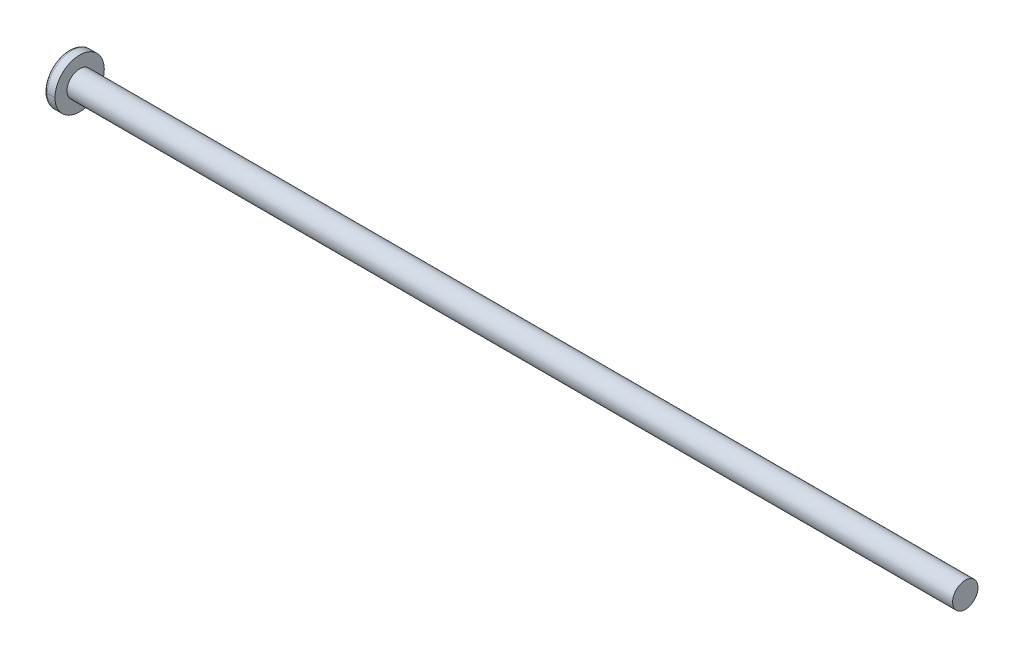
ISO-10303-21;
HEADER;
FILE_DESCRIPTION(('STEP AP214'),'2;1');
FILE_NAME('part.step','',(''),(''),'','','');
FILE_SCHEMA(('AUTOMOTIVE_DESIGN { 1 0 10303 214 1 1 1 1 }'));
ENDSEC;
DATA;
#1=APPLICATION_CONTEXT('core data for automotive mechanical design processes');
#2=APPLICATION_PROTOCOL_DEFINITION('international standard','automotive_design',2000,#1);
#3=PRODUCT_CONTEXT('',#1,'mechanical');
#4=PRODUCT('Part','Part','',(#3));
#5=PRODUCT_RELATED_PRODUCT_CATEGORY('part','',(#4));
#6=PRODUCT_DEFINITION_FORMATION('','',#4);
#7=PRODUCT_DEFINITION_CONTEXT('part definition',#1,'design');
#8=PRODUCT_DEFINITION('design','',#6,#7);
#9=PRODUCT_DEFINITION_SHAPE('','',#8);
#10=(LENGTH_UNIT() NAMED_UNIT(*) SI_UNIT(.MILLI.,.METRE.));
#11=(NAMED_UNIT(*) PLANE_ANGLE_UNIT() SI_UNIT($,.RADIAN.));
#12=(NAMED_UNIT(*) SI_UNIT($,.STERADIAN.) SOLID_ANGLE_UNIT());
#13=UNCERTAINTY_MEASURE_WITH_UNIT(LENGTH_MEASURE(1.E-05),#10,'distance_accuracy_value','');
#14=(GEOMETRIC_REPRESENTATION_CONTEXT(3) GLOBAL_UNCERTAINTY_ASSIGNED_CONTEXT((#13)) GLOBAL_UNIT_ASSIGNED_CONTEXT((#10,
#11,#12)) REPRESENTATION_CONTEXT('',''));
#15=CARTESIAN_POINT('',(0.,0.,0.));
#16=DIRECTION('',(0.,0.,1.));
#17=DIRECTION('',(1.,0.,0.));
#18=AXIS2_PLACEMENT_3D('',#15,#16,#17);
#19=CARTESIAN_POINT('',(-0.334022400521806,2.22044604925031E-13,0.));
#20=DIRECTION('',(1.,0.,0.));
#21=DIRECTION('',(0.,0.,1.));
#22=AXIS2_PLACEMENT_3D('',#19,#20,#21);
#23=CYLINDRICAL_SURFACE('',#22,2.1209);
#24=DIRECTION('',(1.,0.,0.));
#25=VECTOR('',#24,1.);
#26=CARTESIAN_POINT('',(-0.334022400521806,3.88578058618805E-13,2.12090000000008));
#27=LINE('',#26,#25);
#28=CARTESIAN_POINT('',(-0.668044801043613,3.88578058618805E-13,2.12090000000008));
#29=VERTEX_POINT('',#28);
#30=CARTESIAN_POINT('',(0.,-1.11022302462516E-13,2.12090000000002));
#31=VERTEX_POINT('',#30);
#32=EDGE_CURVE('E51',#29,#31,#27,.T.);
#33=ORIENTED_EDGE('',*,*,#32,.F.);
#34=CARTESIAN_POINT('',(-0.668044801043613,2.22044604925031E-13,0.));
#35=DIRECTION('',(1.,0.,0.));
#36=DIRECTION('',(0.,0.,1.));
#37=AXIS2_PLACEMENT_3D('',#34,#35,#36);
#38=CIRCLE('',#37,2.1209);
#39=CARTESIAN_POINT('',(-0.668044801043613,1.11022302462516E-13,-2.12089999999995));
#40=VERTEX_POINT('',#39);
#41=EDGE_CURVE('E167',#29,#40,#38,.T.);
#42=ORIENTED_EDGE('',*,*,#41,.T.);
#43=DIRECTION('',(-1.,0.,0.));
#44=VECTOR('',#43,1.);
#45=CARTESIAN_POINT('',(-0.334022400521806,1.11022302462516E-13,-2.12089999999995));
#46=LINE('',#45,#44);
#47=CARTESIAN_POINT('',(0.,0.,-2.12089999999994));
#48=VERTEX_POINT('',#47);
#49=EDGE_CURVE('E11',#48,#40,#46,.T.);
#50=ORIENTED_EDGE('',*,*,#49,.F.);
#51=CARTESIAN_POINT('',(0.,0.,0.));
#52=DIRECTION('',(1.,0.,0.));
#53=DIRECTION('',(0.,0.,1.));
#54=AXIS2_PLACEMENT_3D('',#51,#52,#53);
#55=CIRCLE('',#54,2.1209);
#56=EDGE_CURVE('E277',#31,#48,#55,.T.);
#57=ORIENTED_EDGE('',*,*,#56,.F.);
#58=EDGE_LOOP('',(#33,#42,#50,#57));
#59=FACE_BOUND('',#58,.T.);
#60=ADVANCED_FACE('F40',(#59),#23,.T.);
#61=CARTESIAN_POINT('',(-0.334022400521806,2.22044604925031E-13,0.));
#62=DIRECTION('',(1.,0.,0.));
#63=DIRECTION('',(0.,0.,1.));
#64=AXIS2_PLACEMENT_3D('',#61,#62,#63);
#65=CYLINDRICAL_SURFACE('',#64,2.1209);
#66=ORIENTED_EDGE('',*,*,#32,.T.);
#67=CARTESIAN_POINT('',(0.,0.,0.));
#68=DIRECTION('',(1.,0.,0.));
#69=DIRECTION('',(0.,0.,1.));
#70=AXIS2_PLACEMENT_3D('',#67,#68,#69);
#71=CIRCLE('',#70,2.1209);
#72=EDGE_CURVE('E250',#48,#31,#71,.T.);
#73=ORIENTED_EDGE('',*,*,#72,.F.);
#74=ORIENTED_EDGE('',*,*,#49,.T.);
#75=CARTESIAN_POINT('',(-0.668044801043613,2.22044604925031E-13,0.));
#76=DIRECTION('',(1.,0.,0.));
#77=DIRECTION('',(0.,0.,1.));
#78=AXIS2_PLACEMENT_3D('',#75,#76,#77);
#79=CIRCLE('',#78,2.1209);
#80=EDGE_CURVE('E173',#40,#29,#79,.T.);
#81=ORIENTED_EDGE('',*,*,#80,.T.);
#82=EDGE_LOOP('',(#66,#73,#74,#81));
#83=FACE_BOUND('',#82,.T.);
#84=ADVANCED_FACE('F409',(#83),#65,.T.);
#85=CARTESIAN_POINT('',(-0.668044801043613,2.22044604925031E-13,0.));
#86=DIRECTION('',(1.,0.,0.));
#87=DIRECTION('',(0.,0.,-1.));
#88=AXIS2_PLACEMENT_3D('',#85,#86,#87);
#89=TOROIDAL_SURFACE('',#88,1.8669,0.254);
#90=CARTESIAN_POINT('',(-0.668044801043613,0.,-1.8669));
#91=DIRECTION('',(0.,-1.,0.));
#92=DIRECTION('',(0.,0.,-1.));
#93=AXIS2_PLACEMENT_3D('',#90,#91,#92);
#94=CIRCLE('',#93,0.254);
#95=CARTESIAN_POINT('',(-0.866705762537757,0.,-2.02517135678376));
#96=VERTEX_POINT('',#95);
#97=EDGE_CURVE('E174',#96,#40,#94,.T.);
#98=ORIENTED_EDGE('',*,*,#97,.T.);
#99=ORIENTED_EDGE('',*,*,#41,.F.);
#100=CARTESIAN_POINT('',(-0.668044801043606,2.22044604925031E-13,1.86690000000018));
#101=DIRECTION('',(0.,-1.,0.));
#102=DIRECTION('',(0.,0.,1.));
#103=AXIS2_PLACEMENT_3D('',#100,#101,#102);
#104=CIRCLE('',#103,0.254);
#105=CARTESIAN_POINT('',(-0.866705762537751,0.,2.02517135678391));
#106=VERTEX_POINT('',#105);
#107=EDGE_CURVE('E161',#29,#106,#104,.T.);
#108=ORIENTED_EDGE('',*,*,#107,.T.);
#109=CARTESIAN_POINT('',(-0.866705762537757,2.22044604925031E-13,0.));
#110=DIRECTION('',(1.,0.,0.));
#111=DIRECTION('',(0.,0.,1.));
#112=AXIS2_PLACEMENT_3D('',#109,#110,#111);
#113=CIRCLE('',#112,2.02517135678392);
#114=EDGE_CURVE('E165',#106,#96,#113,.T.);
#115=ORIENTED_EDGE('',*,*,#114,.T.);
#116=EDGE_LOOP('',(#98,#99,#108,#115));
#117=FACE_BOUND('',#116,.T.);
#118=ADVANCED_FACE('F164',(#117),#89,.T.);
#119=CARTESIAN_POINT('',(0.,0.,1.06045000000005));
#120=DIRECTION('',(1.,0.,0.));
#121=DIRECTION('',(0.,0.,1.));
#122=AXIS2_PLACEMENT_3D('',#119,#120,#121);
#123=PLANE('',#122);
#124=ORIENTED_EDGE('',*,*,#56,.T.);
#125=ORIENTED_EDGE('',*,*,#72,.T.);
#126=EDGE_LOOP('',(#124,#125));
#127=FACE_BOUND('',#126,.T.);
#128=CARTESIAN_POINT('',(0.,0.,0.));
#129=DIRECTION('',(-1.,0.,0.));
#130=DIRECTION('',(0.,0.,-1.));
#131=AXIS2_PLACEMENT_3D('',#128,#129,#130);
#132=CIRCLE('',#131,1.0922);
#133=CARTESIAN_POINT('',(0.,0.,-1.0922));
#134=VERTEX_POINT('',#133);
#135=EDGE_CURVE('E44',#134,#134,#132,.T.);
#136=ORIENTED_EDGE('',*,*,#135,.T.);
#137=EDGE_LOOP('',(#136));
#138=FACE_BOUND('',#137,.T.);
#139=ADVANCED_FACE('F486',(#127,#138),#123,.T.);
#140=CARTESIAN_POINT('',(-0.668044801043613,2.22044604925031E-13,0.));
#141=DIRECTION('',(1.,0.,0.));
#142=DIRECTION('',(0.,0.,-1.));
#143=AXIS2_PLACEMENT_3D('',#140,#141,#142);
#144=TOROIDAL_SURFACE('',#143,1.8669,0.254);
#145=ORIENTED_EDGE('',*,*,#97,.F.);
#146=CARTESIAN_POINT('',(-0.866705762537757,2.22044604925031E-13,0.));
#147=DIRECTION('',(1.,0.,0.));
#148=DIRECTION('',(0.,0.,1.));
#149=AXIS2_PLACEMENT_3D('',#146,#147,#148);
#150=CIRCLE('',#149,2.02517135678392);
#151=EDGE_CURVE('E187',#96,#106,#150,.T.);
#152=ORIENTED_EDGE('',*,*,#151,.T.);
#153=ORIENTED_EDGE('',*,*,#107,.F.);
#154=ORIENTED_EDGE('',*,*,#80,.F.);
#155=EDGE_LOOP('',(#145,#152,#153,#154));
#156=FACE_BOUND('',#155,.T.);
#157=ADVANCED_FACE('F188',(#156),#144,.T.);
#158=CARTESIAN_POINT('',(1.67527338709678,0.,0.));
#159=DIRECTION('',(0.,0.,1.));
#160=DIRECTION('',(1.,0.,0.));
#161=AXIS2_PLACEMENT_3D('',#158,#159,#160);
#162=SPHERICAL_SURFACE('',#161,3.25007338709678);
#163=CARTESIAN_POINT('',(1.67527338709678,0.,0.));
#164=DIRECTION('',(0.,-1.,0.));
#165=DIRECTION('',(0.,0.,1.));
#166=AXIS2_PLACEMENT_3D('',#163,#164,#165);
#167=CIRCLE('',#166,3.25007338709678);
#168=CARTESIAN_POINT('',(-1.33228366332031,-1.11022302462516E-13,1.23189999999998));
#169=VERTEX_POINT('',#168);
#170=EDGE_CURVE('E180',#106,#169,#167,.T.);
#171=ORIENTED_EDGE('',*,*,#170,.T.);
#172=CARTESIAN_POINT('',(1.67527338709678,0.,1.23190000000004));
#173=DIRECTION('',(0.,0.,1.));
#174=DIRECTION('',(0.,1.,0.));
#175=AXIS2_PLACEMENT_3D('',#172,#173,#174);
#176=CIRCLE('',#175,3.00755705041729);
#177=CARTESIAN_POINT('',(-1.32452437300552,-0.215900000000047,1.23190000000013));
#178=VERTEX_POINT('',#177);
#179=EDGE_CURVE('E198',#169,#178,#176,.T.);
#180=ORIENTED_EDGE('',*,*,#179,.T.);
#181=CARTESIAN_POINT('',(1.67527338709678,-0.215899999999436,3.60822483003176E-13));
#182=DIRECTION('',(0.,-1.,0.));
#183=DIRECTION('',(0.,0.,1.));
#184=AXIS2_PLACEMENT_3D('',#181,#182,#183);
#185=CIRCLE('',#184,3.24289441880471);
#186=CARTESIAN_POINT('',(-1.5604261356517,-0.215899999999991,0.215900000000033));
#187=VERTEX_POINT('',#186);
#188=EDGE_CURVE('E266',#178,#187,#185,.T.);
#189=ORIENTED_EDGE('',*,*,#188,.T.);
#190=CARTESIAN_POINT('',(1.67527338709678,0.,0.215900000000005));
#191=DIRECTION('',(0.,0.,1.));
#192=DIRECTION('',(0.,1.,0.));
#193=AXIS2_PLACEMENT_3D('',#190,#191,#192);
#194=CIRCLE('',#193,3.24289441880471);
#195=CARTESIAN_POINT('',(-1.32452437300552,-1.23189999999979,0.215900000000047));
#196=VERTEX_POINT('',#195);
#197=EDGE_CURVE('E241',#187,#196,#194,.T.);
#198=ORIENTED_EDGE('',*,*,#197,.T.);
#199=CARTESIAN_POINT('',(1.67527338709678,-1.2318999999999,0.));
#200=DIRECTION('',(0.,-1.,0.));
#201=DIRECTION('',(0.,0.,1.));
#202=AXIS2_PLACEMENT_3D('',#199,#200,#201);
#203=CIRCLE('',#202,3.00755705041729);
#204=CARTESIAN_POINT('',(-1.32452437300552,-1.23189999999979,-0.215899999999922));
#205=VERTEX_POINT('',#204);
#206=EDGE_CURVE('E242',#196,#205,#203,.T.);
#207=ORIENTED_EDGE('',*,*,#206,.T.);
#208=CARTESIAN_POINT('',(1.67527338709678,1.11022302462516E-13,-0.215899999999852));
#209=DIRECTION('',(0.,0.,-1.));
#210=DIRECTION('',(0.,-1.,0.));
#211=AXIS2_PLACEMENT_3D('',#208,#209,#210);
#212=CIRCLE('',#211,3.24289441880471);
#213=CARTESIAN_POINT('',(-1.56042613565169,-0.21589999999988,-0.215899999999991));
#214=VERTEX_POINT('',#213);
#215=EDGE_CURVE('E301',#205,#214,#212,.T.);
#216=ORIENTED_EDGE('',*,*,#215,.T.);
#217=CARTESIAN_POINT('',(1.67527338709678,-0.215899999999436,3.60822483003176E-13));
#218=DIRECTION('',(0.,-1.,0.));
#219=DIRECTION('',(0.,0.,1.));
#220=AXIS2_PLACEMENT_3D('',#217,#218,#219);
#221=CIRCLE('',#220,3.24289441880471);
#222=CARTESIAN_POINT('',(-1.32452437300552,-0.215899999999936,-1.23189999999994));
#223=VERTEX_POINT('',#222);
#224=EDGE_CURVE('E211',#214,#223,#221,.T.);
#225=ORIENTED_EDGE('',*,*,#224,.T.);
#226=CARTESIAN_POINT('',(1.67527338709678,0.,-1.23189999999997));
#227=DIRECTION('',(0.,0.,-1.));
#228=DIRECTION('',(0.,-1.,0.));
#229=AXIS2_PLACEMENT_3D('',#226,#227,#228);
#230=CIRCLE('',#229,3.00755705041729);
#231=CARTESIAN_POINT('',(-1.33228366332051,0.,-1.23190000000005));
#232=VERTEX_POINT('',#231);
#233=EDGE_CURVE('E333',#223,#232,#230,.T.);
#234=ORIENTED_EDGE('',*,*,#233,.T.);
#235=CARTESIAN_POINT('',(1.67527338709678,0.,0.));
#236=DIRECTION('',(0.,-1.,0.));
#237=DIRECTION('',(0.,0.,1.));
#238=AXIS2_PLACEMENT_3D('',#235,#236,#237);
#239=CIRCLE('',#238,3.25007338709678);
#240=EDGE_CURVE('E183',#232,#96,#239,.T.);
#241=ORIENTED_EDGE('',*,*,#240,.T.);
#242=ORIENTED_EDGE('',*,*,#114,.F.);
#243=EDGE_LOOP('',(#171,#180,#189,#198,#207,#216,#225,#234,#241,#242));
#244=FACE_BOUND('',#243,.T.);
#245=ADVANCED_FACE('F177',(#244),#162,.T.);
#246=CARTESIAN_POINT('',(4.7625,0.,0.));
#247=DIRECTION('',(-1.,0.,0.));
#248=DIRECTION('',(0.,0.,-1.));
#249=AXIS2_PLACEMENT_3D('',#246,#247,#248);
#250=CYLINDRICAL_SURFACE('',#249,1.0922);
#251=ORIENTED_EDGE('',*,*,#135,.F.);
#252=EDGE_LOOP('',(#251));
#253=FACE_BOUND('',#252,.T.);
#254=CARTESIAN_POINT('',(76.2,0.,1.11022302462516E-13));
#255=DIRECTION('',(1.,0.,0.));
#256=DIRECTION('',(0.,0.,-1.));
#257=AXIS2_PLACEMENT_3D('',#254,#255,#256);
#258=CIRCLE('',#257,1.0922);
#259=CARTESIAN_POINT('',(76.2,0.,-1.09219999999989));
#260=VERTEX_POINT('',#259);
#261=EDGE_CURVE('E343',#260,#260,#258,.T.);
#262=ORIENTED_EDGE('',*,*,#261,.F.);
#263=EDGE_LOOP('',(#262));
#264=FACE_BOUND('',#263,.T.);
#265=ADVANCED_FACE('F473',(#253,#264),#250,.T.);
#266=CARTESIAN_POINT('',(1.67527338709678,0.,0.));
#267=DIRECTION('',(0.,0.,1.));
#268=DIRECTION('',(1.,0.,0.));
#269=AXIS2_PLACEMENT_3D('',#266,#267,#268);
#270=SPHERICAL_SURFACE('',#269,3.25007338709678);
#271=ORIENTED_EDGE('',*,*,#170,.F.);
#272=ORIENTED_EDGE('',*,*,#151,.F.);
#273=ORIENTED_EDGE('',*,*,#240,.F.);
#274=CARTESIAN_POINT('',(1.67527338709678,0.,-1.23189999999997));
#275=DIRECTION('',(0.,0.,-1.));
#276=DIRECTION('',(0.,-1.,0.));
#277=AXIS2_PLACEMENT_3D('',#274,#275,#276);
#278=CIRCLE('',#277,3.00755705041729);
#279=CARTESIAN_POINT('',(-1.32452437300552,0.215900000000102,-1.23190000000001));
#280=VERTEX_POINT('',#279);
#281=EDGE_CURVE('E212',#232,#280,#278,.T.);
#282=ORIENTED_EDGE('',*,*,#281,.T.);
#283=CARTESIAN_POINT('',(1.67527338709678,0.215899999999991,0.));
#284=DIRECTION('',(0.,1.,0.));
#285=DIRECTION('',(0.,0.,-1.));
#286=AXIS2_PLACEMENT_3D('',#283,#284,#285);
#287=CIRCLE('',#286,3.24289441880471);
#288=CARTESIAN_POINT('',(-1.5604261356517,0.215900000000213,-0.215899999999936));
#289=VERTEX_POINT('',#288);
#290=EDGE_CURVE('E218',#280,#289,#287,.T.);
#291=ORIENTED_EDGE('',*,*,#290,.T.);
#292=CARTESIAN_POINT('',(1.67527338709678,1.11022302462516E-13,-0.215899999999852));
#293=DIRECTION('',(0.,0.,-1.));
#294=DIRECTION('',(0.,-1.,0.));
#295=AXIS2_PLACEMENT_3D('',#292,#293,#294);
#296=CIRCLE('',#295,3.24289441880471);
#297=CARTESIAN_POINT('',(-1.32452437300552,1.23190000000001,-0.215899999999949));
#298=VERTEX_POINT('',#297);
#299=EDGE_CURVE('E271',#289,#298,#296,.T.);
#300=ORIENTED_EDGE('',*,*,#299,.T.);
#301=CARTESIAN_POINT('',(1.67527338709679,1.23190000000029,1.66533453693773E-13));
#302=DIRECTION('',(0.,1.,0.));
#303=DIRECTION('',(0.,0.,-1.));
#304=AXIS2_PLACEMENT_3D('',#301,#302,#303);
#305=CIRCLE('',#304,3.00755705041729);
#306=CARTESIAN_POINT('',(-1.32452437300552,1.23190000000001,0.215899999999991));
#307=VERTEX_POINT('',#306);
#308=EDGE_CURVE('E270',#298,#307,#305,.T.);
#309=ORIENTED_EDGE('',*,*,#308,.T.);
#310=CARTESIAN_POINT('',(1.67527338709678,0.,0.215900000000005));
#311=DIRECTION('',(0.,0.,1.));
#312=DIRECTION('',(0.,1.,0.));
#313=AXIS2_PLACEMENT_3D('',#310,#311,#312);
#314=CIRCLE('',#313,3.24289441880471);
#315=CARTESIAN_POINT('',(-1.5604261356517,0.215900000000047,0.215899999999963));
#316=VERTEX_POINT('',#315);
#317=EDGE_CURVE('E206',#307,#316,#314,.T.);
#318=ORIENTED_EDGE('',*,*,#317,.T.);
#319=CARTESIAN_POINT('',(1.67527338709678,0.215899999999991,0.));
#320=DIRECTION('',(0.,1.,0.));
#321=DIRECTION('',(0.,0.,-1.));
#322=AXIS2_PLACEMENT_3D('',#319,#320,#321);
#323=CIRCLE('',#322,3.24289441880471);
#324=CARTESIAN_POINT('',(-1.32452437300552,0.215900000000102,1.23190000000008));
#325=VERTEX_POINT('',#324);
#326=EDGE_CURVE('E223',#316,#325,#323,.T.);
#327=ORIENTED_EDGE('',*,*,#326,.T.);
#328=CARTESIAN_POINT('',(1.67527338709678,0.,1.23190000000004));
#329=DIRECTION('',(0.,0.,1.));
#330=DIRECTION('',(0.,1.,0.));
#331=AXIS2_PLACEMENT_3D('',#328,#329,#330);
#332=CIRCLE('',#331,3.00755705041729);
#333=EDGE_CURVE('E196',#325,#169,#332,.T.);
#334=ORIENTED_EDGE('',*,*,#333,.T.);
#335=EDGE_LOOP('',(#271,#272,#273,#282,#291,#300,#309,#318,#327,#334));
#336=FACE_BOUND('',#335,.T.);
#337=ADVANCED_FACE('F193',(#336),#270,.T.);
#338=CARTESIAN_POINT('',(-0.914399999999801,-1.11022302462516E-13,1.23189999999998));
#339=DIRECTION('',(0.,0.,1.));
#340=DIRECTION('',(1.,0.,0.));
#341=AXIS2_PLACEMENT_3D('',#338,#339,#340);
#342=PLANE('',#341);
#343=ORIENTED_EDGE('',*,*,#333,.F.);
#344=DIRECTION('',(-1.,0.,0.));
#345=VECTOR('',#344,1.);
#346=CARTESIAN_POINT('',(-0.914399999999996,0.215900000000102,1.23190000000008));
#347=LINE('',#346,#345);
#348=CARTESIAN_POINT('',(-0.253999999999997,0.215900000000213,1.23190000000008));
#349=VERTEX_POINT('',#348);
#350=EDGE_CURVE('E216',#349,#325,#347,.T.);
#351=ORIENTED_EDGE('',*,*,#350,.F.);
#352=DIRECTION('',(0.,1.,0.));
#353=VECTOR('',#352,1.);
#354=CARTESIAN_POINT('',(-0.253999999999803,0.,1.23189999999997));
#355=LINE('',#354,#353);
#356=CARTESIAN_POINT('',(-0.254000000000004,-0.215899999999603,1.23190000000026));
#357=VERTEX_POINT('',#356);
#358=EDGE_CURVE('E337',#357,#349,#355,.T.);
#359=ORIENTED_EDGE('',*,*,#358,.F.);
#360=DIRECTION('',(1.,0.,0.));
#361=VECTOR('',#360,1.);
#362=CARTESIAN_POINT('',(-0.914400000000003,-0.215900000000047,1.23190000000013));
#363=LINE('',#362,#361);
#364=EDGE_CURVE('E326',#178,#357,#363,.T.);
#365=ORIENTED_EDGE('',*,*,#364,.F.);
#366=ORIENTED_EDGE('',*,*,#179,.F.);
#367=EDGE_LOOP('',(#343,#351,#359,#365,#366));
#368=FACE_BOUND('',#367,.T.);
#369=ADVANCED_FACE('F435',(#368),#342,.F.);
#370=CARTESIAN_POINT('',(-0.914399999999996,-0.21589999999988,1.11022302462516E-13));
#371=DIRECTION('',(0.,1.,0.));
#372=DIRECTION('',(1.,0.,0.));
#373=AXIS2_PLACEMENT_3D('',#370,#371,#372);
#374=PLANE('',#373);
#375=DIRECTION('',(-1.,0.,0.));
#376=VECTOR('',#375,1.);
#377=CARTESIAN_POINT('',(-0.914399999999996,-0.215899999999825,0.21590000000006));
#378=LINE('',#377,#376);
#379=CARTESIAN_POINT('',(-0.253999999999997,-0.215899999999769,0.21590000000006));
#380=VERTEX_POINT('',#379);
#381=EDGE_CURVE('E245',#380,#187,#378,.T.);
#382=ORIENTED_EDGE('',*,*,#381,.T.);
#383=ORIENTED_EDGE('',*,*,#188,.F.);
#384=ORIENTED_EDGE('',*,*,#364,.T.);
#385=DIRECTION('',(0.,0.,-1.));
#386=VECTOR('',#385,1.);
#387=CARTESIAN_POINT('',(-0.253999999999997,-0.21589999999988,1.11022302462516E-13));
#388=LINE('',#387,#386);
#389=EDGE_CURVE('E230',#357,#380,#388,.T.);
#390=ORIENTED_EDGE('',*,*,#389,.T.);
#391=EDGE_LOOP('',(#382,#383,#384,#390));
#392=FACE_BOUND('',#391,.T.);
#393=ADVANCED_FACE('F428',(#392),#374,.T.);
#394=CARTESIAN_POINT('',(-0.914400000000003,1.11022302462516E-13,0.215899999999977));
#395=DIRECTION('',(0.,0.,-1.));
#396=DIRECTION('',(0.,-1.,0.));
#397=AXIS2_PLACEMENT_3D('',#394,#395,#396);
#398=PLANE('',#397);
#399=ORIENTED_EDGE('',*,*,#197,.F.);
#400=ORIENTED_EDGE('',*,*,#381,.F.);
#401=DIRECTION('',(0.,1.,0.));
#402=VECTOR('',#401,1.);
#403=CARTESIAN_POINT('',(-0.253999999999997,1.11022302462516E-13,0.215899999999977));
#404=LINE('',#403,#402);
#405=CARTESIAN_POINT('',(-0.253999999999997,-1.23189999999979,0.215900000000047));
#406=VERTEX_POINT('',#405);
#407=EDGE_CURVE('E226',#406,#380,#404,.T.);
#408=ORIENTED_EDGE('',*,*,#407,.F.);
#409=DIRECTION('',(-1.,0.,0.));
#410=VECTOR('',#409,1.);
#411=CARTESIAN_POINT('',(-0.914400000000003,-1.23189999999979,0.215900000000047));
#412=LINE('',#411,#410);
#413=EDGE_CURVE('E237',#406,#196,#412,.T.);
#414=ORIENTED_EDGE('',*,*,#413,.T.);
#415=EDGE_LOOP('',(#399,#400,#408,#414));
#416=FACE_BOUND('',#415,.T.);
#417=ADVANCED_FACE('F426',(#416),#398,.T.);
#418=CARTESIAN_POINT('',(-0.914399999999996,-1.23189999999995,0.));
#419=DIRECTION('',(0.,-1.,0.));
#420=DIRECTION('',(-1.,0.,0.));
#421=AXIS2_PLACEMENT_3D('',#418,#419,#420);
#422=PLANE('',#421);
#423=ORIENTED_EDGE('',*,*,#206,.F.);
#424=ORIENTED_EDGE('',*,*,#413,.F.);
#425=DIRECTION('',(0.,0.,1.));
#426=VECTOR('',#425,1.);
#427=CARTESIAN_POINT('',(-0.253999999999997,-1.23189999999973,0.));
#428=LINE('',#427,#426);
#429=CARTESIAN_POINT('',(-0.253999999999997,-1.23189999999956,-0.215899999999866));
#430=VERTEX_POINT('',#429);
#431=EDGE_CURVE('E231',#430,#406,#428,.T.);
#432=ORIENTED_EDGE('',*,*,#431,.F.);
#433=DIRECTION('',(1.,0.,0.));
#434=VECTOR('',#433,1.);
#435=CARTESIAN_POINT('',(-0.914399999999996,-1.23189999999979,-0.215899999999922));
#436=LINE('',#435,#434);
#437=EDGE_CURVE('E253',#205,#430,#436,.T.);
#438=ORIENTED_EDGE('',*,*,#437,.F.);
#439=EDGE_LOOP('',(#423,#424,#432,#438));
#440=FACE_BOUND('',#439,.T.);
#441=ADVANCED_FACE('F419',(#440),#422,.F.);
#442=CARTESIAN_POINT('',(-0.914400000000003,0.,-0.215899999999908));
#443=DIRECTION('',(0.,0.,1.));
#444=DIRECTION('',(0.,-1.,0.));
#445=AXIS2_PLACEMENT_3D('',#442,#443,#444);
#446=PLANE('',#445);
#447=ORIENTED_EDGE('',*,*,#215,.F.);
#448=ORIENTED_EDGE('',*,*,#437,.T.);
#449=DIRECTION('',(0.,1.,0.));
#450=VECTOR('',#449,1.);
#451=CARTESIAN_POINT('',(-0.253999999999997,2.22044604925031E-13,-0.215899999999852));
#452=LINE('',#451,#450);
#453=CARTESIAN_POINT('',(-0.253999999999997,-0.215899999999658,-0.215899999999672));
#454=VERTEX_POINT('',#453);
#455=EDGE_CURVE('E232',#430,#454,#452,.T.);
#456=ORIENTED_EDGE('',*,*,#455,.T.);
#457=DIRECTION('',(1.,0.,0.));
#458=VECTOR('',#457,1.);
#459=CARTESIAN_POINT('',(-0.914399999999996,-0.21589999999988,-0.215899999999991));
#460=LINE('',#459,#458);
#461=EDGE_CURVE('E208',#214,#454,#460,.T.);
#462=ORIENTED_EDGE('',*,*,#461,.F.);
#463=EDGE_LOOP('',(#447,#448,#456,#462));
#464=FACE_BOUND('',#463,.T.);
#465=ADVANCED_FACE('F423',(#464),#446,.T.);
#466=CARTESIAN_POINT('',(-0.914399999999996,-0.21589999999988,1.11022302462516E-13));
#467=DIRECTION('',(0.,1.,0.));
#468=DIRECTION('',(1.,0.,0.));
#469=AXIS2_PLACEMENT_3D('',#466,#467,#468);
#470=PLANE('',#469);
#471=ORIENTED_EDGE('',*,*,#461,.T.);
#472=DIRECTION('',(0.,0.,-1.));
#473=VECTOR('',#472,1.);
#474=CARTESIAN_POINT('',(-0.253999999999997,-0.21589999999988,1.11022302462516E-13));
#475=LINE('',#474,#473);
#476=CARTESIAN_POINT('',(-0.254000000000004,-0.215899999999769,-1.2318999999998));
#477=VERTEX_POINT('',#476);
#478=EDGE_CURVE('E236',#454,#477,#475,.T.);
#479=ORIENTED_EDGE('',*,*,#478,.T.);
#480=DIRECTION('',(-1.,0.,0.));
#481=VECTOR('',#480,1.);
#482=CARTESIAN_POINT('',(-0.914400000000003,-0.215899999999936,-1.23189999999994));
#483=LINE('',#482,#481);
#484=EDGE_CURVE('E329',#477,#223,#483,.T.);
#485=ORIENTED_EDGE('',*,*,#484,.T.);
#486=ORIENTED_EDGE('',*,*,#224,.F.);
#487=EDGE_LOOP('',(#471,#479,#485,#486));
#488=FACE_BOUND('',#487,.T.);
#489=ADVANCED_FACE('F425',(#488),#470,.T.);
#490=CARTESIAN_POINT('',(-0.914399999999996,1.11022302462516E-13,-1.23189999999998));
#491=DIRECTION('',(0.,0.,1.));
#492=DIRECTION('',(1.,0.,0.));
#493=AXIS2_PLACEMENT_3D('',#490,#491,#492);
#494=PLANE('',#493);
#495=ORIENTED_EDGE('',*,*,#233,.F.);
#496=ORIENTED_EDGE('',*,*,#484,.F.);
#497=DIRECTION('',(0.,-1.,0.));
#498=VECTOR('',#497,1.);
#499=CARTESIAN_POINT('',(-0.253999999999997,1.66533453693773E-13,-1.23189999999995));
#500=LINE('',#499,#498);
#501=CARTESIAN_POINT('',(-0.253999999999997,0.215900000000269,-1.23189999999988));
#502=VERTEX_POINT('',#501);
#503=EDGE_CURVE('E258',#502,#477,#500,.T.);
#504=ORIENTED_EDGE('',*,*,#503,.F.);
#505=DIRECTION('',(1.,0.,0.));
#506=VECTOR('',#505,1.);
#507=CARTESIAN_POINT('',(-0.914399999999996,0.215900000000102,-1.23190000000001));
#508=LINE('',#507,#506);
#509=EDGE_CURVE('E221',#280,#502,#508,.T.);
#510=ORIENTED_EDGE('',*,*,#509,.F.);
#511=ORIENTED_EDGE('',*,*,#281,.F.);
#512=EDGE_LOOP('',(#495,#496,#504,#510,#511));
#513=FACE_BOUND('',#512,.T.);
#514=ADVANCED_FACE('F42',(#513),#494,.T.);
#515=CARTESIAN_POINT('',(-0.914400000000003,0.215900000000324,0.));
#516=DIRECTION('',(0.,-1.,0.));
#517=DIRECTION('',(0.,0.,-1.));
#518=AXIS2_PLACEMENT_3D('',#515,#516,#517);
#519=PLANE('',#518);
#520=DIRECTION('',(-1.,0.,0.));
#521=VECTOR('',#520,1.);
#522=CARTESIAN_POINT('',(-0.914400000000003,0.215900000000213,-0.215899999999936));
#523=LINE('',#522,#521);
#524=CARTESIAN_POINT('',(-0.254000000000004,0.215900000000213,-0.215899999999936));
#525=VERTEX_POINT('',#524);
#526=EDGE_CURVE('E222',#525,#289,#523,.T.);
#527=ORIENTED_EDGE('',*,*,#526,.T.);
#528=ORIENTED_EDGE('',*,*,#290,.F.);
#529=ORIENTED_EDGE('',*,*,#509,.T.);
#530=DIRECTION('',(0.,0.,-1.));
#531=VECTOR('',#530,1.);
#532=CARTESIAN_POINT('',(-0.254000000000004,0.215900000000324,0.));
#533=LINE('',#532,#531);
#534=EDGE_CURVE('E262',#525,#502,#533,.T.);
#535=ORIENTED_EDGE('',*,*,#534,.F.);
#536=EDGE_LOOP('',(#527,#528,#529,#535));
#537=FACE_BOUND('',#536,.T.);
#538=ADVANCED_FACE('F393',(#537),#519,.T.);
#539=CARTESIAN_POINT('',(-0.914400000000003,0.,-0.215899999999908));
#540=DIRECTION('',(0.,0.,1.));
#541=DIRECTION('',(0.,-1.,0.));
#542=AXIS2_PLACEMENT_3D('',#539,#540,#541);
#543=PLANE('',#542);
#544=ORIENTED_EDGE('',*,*,#299,.F.);
#545=ORIENTED_EDGE('',*,*,#526,.F.);
#546=DIRECTION('',(0.,1.,0.));
#547=VECTOR('',#546,1.);
#548=CARTESIAN_POINT('',(-0.253999999999997,2.22044604925031E-13,-0.215899999999852));
#549=LINE('',#548,#547);
#550=CARTESIAN_POINT('',(-0.253999999999997,1.23190000000045,-0.215899999999644));
#551=VERTEX_POINT('',#550);
#552=EDGE_CURVE('E217',#525,#551,#549,.T.);
#553=ORIENTED_EDGE('',*,*,#552,.T.);
#554=DIRECTION('',(-1.,0.,0.));
#555=VECTOR('',#554,1.);
#556=CARTESIAN_POINT('',(-0.914400000000003,1.23190000000001,-0.215899999999949));
#557=LINE('',#556,#555);
#558=EDGE_CURVE('E274',#551,#298,#557,.T.);
#559=ORIENTED_EDGE('',*,*,#558,.T.);
#560=EDGE_LOOP('',(#544,#545,#553,#559));
#561=FACE_BOUND('',#560,.T.);
#562=ADVANCED_FACE('F395',(#561),#543,.T.);
#563=CARTESIAN_POINT('',(-0.914400000000003,1.23189999999995,0.));
#564=DIRECTION('',(0.,-1.,0.));
#565=DIRECTION('',(-1.,0.,0.));
#566=AXIS2_PLACEMENT_3D('',#563,#564,#565);
#567=PLANE('',#566);
#568=ORIENTED_EDGE('',*,*,#308,.F.);
#569=ORIENTED_EDGE('',*,*,#558,.F.);
#570=DIRECTION('',(0.,0.,-1.));
#571=VECTOR('',#570,1.);
#572=CARTESIAN_POINT('',(-0.254000000000004,1.23190000000029,1.94289029309402E-13));
#573=LINE('',#572,#571);
#574=CARTESIAN_POINT('',(-0.254000000000004,1.23190000000023,0.215900000000074));
#575=VERTEX_POINT('',#574);
#576=EDGE_CURVE('E282',#575,#551,#573,.T.);
#577=ORIENTED_EDGE('',*,*,#576,.F.);
#578=DIRECTION('',(1.,0.,0.));
#579=VECTOR('',#578,1.);
#580=CARTESIAN_POINT('',(-0.914400000000003,1.23190000000001,0.215899999999991));
#581=LINE('',#580,#579);
#582=EDGE_CURVE('E267',#307,#575,#581,.T.);
#583=ORIENTED_EDGE('',*,*,#582,.F.);
#584=EDGE_LOOP('',(#568,#569,#577,#583));
#585=FACE_BOUND('',#584,.T.);
#586=ADVANCED_FACE('F397',(#585),#567,.T.);
#587=CARTESIAN_POINT('',(-0.914400000000003,1.11022302462516E-13,0.215899999999977));
#588=DIRECTION('',(0.,0.,-1.));
#589=DIRECTION('',(0.,-1.,0.));
#590=AXIS2_PLACEMENT_3D('',#587,#588,#589);
#591=PLANE('',#590);
#592=ORIENTED_EDGE('',*,*,#317,.F.);
#593=ORIENTED_EDGE('',*,*,#582,.T.);
#594=DIRECTION('',(0.,1.,0.));
#595=VECTOR('',#594,1.);
#596=CARTESIAN_POINT('',(-0.253999999999997,1.11022302462516E-13,0.215899999999977));
#597=LINE('',#596,#595);
#598=CARTESIAN_POINT('',(-0.254000000000004,0.215900000000269,0.21590000000031));
#599=VERTEX_POINT('',#598);
#600=EDGE_CURVE('E278',#599,#575,#597,.T.);
#601=ORIENTED_EDGE('',*,*,#600,.F.);
#602=DIRECTION('',(1.,0.,0.));
#603=VECTOR('',#602,1.);
#604=CARTESIAN_POINT('',(-0.914400000000003,0.215900000000269,0.21590000000031));
#605=LINE('',#604,#603);
#606=EDGE_CURVE('E213',#316,#599,#605,.T.);
#607=ORIENTED_EDGE('',*,*,#606,.F.);
#608=EDGE_LOOP('',(#592,#593,#601,#607));
#609=FACE_BOUND('',#608,.T.);
#610=ADVANCED_FACE('F403',(#609),#591,.T.);
#611=CARTESIAN_POINT('',(-0.914400000000003,0.215900000000324,0.));
#612=DIRECTION('',(0.,-1.,0.));
#613=DIRECTION('',(0.,0.,-1.));
#614=AXIS2_PLACEMENT_3D('',#611,#612,#613);
#615=PLANE('',#614);
#616=ORIENTED_EDGE('',*,*,#606,.T.);
#617=DIRECTION('',(0.,0.,-1.));
#618=VECTOR('',#617,1.);
#619=CARTESIAN_POINT('',(-0.254000000000004,0.215900000000324,0.));
#620=LINE('',#619,#618);
#621=EDGE_CURVE('E283',#349,#599,#620,.T.);
#622=ORIENTED_EDGE('',*,*,#621,.F.);
#623=ORIENTED_EDGE('',*,*,#350,.T.);
#624=ORIENTED_EDGE('',*,*,#326,.F.);
#625=EDGE_LOOP('',(#616,#622,#623,#624));
#626=FACE_BOUND('',#625,.T.);
#627=ADVANCED_FACE('F366',(#626),#615,.T.);
#628=CARTESIAN_POINT('',(-0.253999999999997,2.22044604925031E-13,0.));
#629=DIRECTION('',(-1.,0.,0.));
#630=DIRECTION('',(0.,0.,1.));
#631=AXIS2_PLACEMENT_3D('',#628,#629,#630);
#632=PLANE('',#631);
#633=ORIENTED_EDGE('',*,*,#534,.T.);
#634=ORIENTED_EDGE('',*,*,#503,.T.);
#635=ORIENTED_EDGE('',*,*,#478,.F.);
#636=ORIENTED_EDGE('',*,*,#455,.F.);
#637=ORIENTED_EDGE('',*,*,#431,.T.);
#638=ORIENTED_EDGE('',*,*,#407,.T.);
#639=ORIENTED_EDGE('',*,*,#389,.F.);
#640=ORIENTED_EDGE('',*,*,#358,.T.);
#641=ORIENTED_EDGE('',*,*,#621,.T.);
#642=ORIENTED_EDGE('',*,*,#600,.T.);
#643=ORIENTED_EDGE('',*,*,#576,.T.);
#644=ORIENTED_EDGE('',*,*,#552,.F.);
#645=EDGE_LOOP('',(#633,#634,#635,#636,#637,#638,#639,#640,#641,#642,#643,#644));
#646=FACE_BOUND('',#645,.T.);
#647=ADVANCED_FACE('F360',(#646),#632,.T.);
#648=CARTESIAN_POINT('',(76.2,0.,1.11022302462516E-13));
#649=DIRECTION('',(1.,0.,0.));
#650=DIRECTION('',(0.,0.,-1.));
#651=AXIS2_PLACEMENT_3D('',#648,#649,#650);
#652=PLANE('',#651);
#653=ORIENTED_EDGE('',*,*,#261,.T.);
#654=EDGE_LOOP('',(#653));
#655=FACE_BOUND('',#654,.T.);
#656=ADVANCED_FACE('F471',(#655),#652,.T.);
#657=CLOSED_SHELL('',(#60,#84,#118,#139,#157,#245,#265,#337,#369,#393,#417,#441,#465,#489,#514,
#538,#562,#586,#610,#627,#647,#656));
#658=MANIFOLD_SOLID_BREP('B2',#657);
#659=ADVANCED_BREP_SHAPE_REPRESENTATION('',(#18,#658),#14);
#660=SHAPE_DEFINITION_REPRESENTATION(#9,#659);
ENDSEC;
END-ISO-10303-21;
